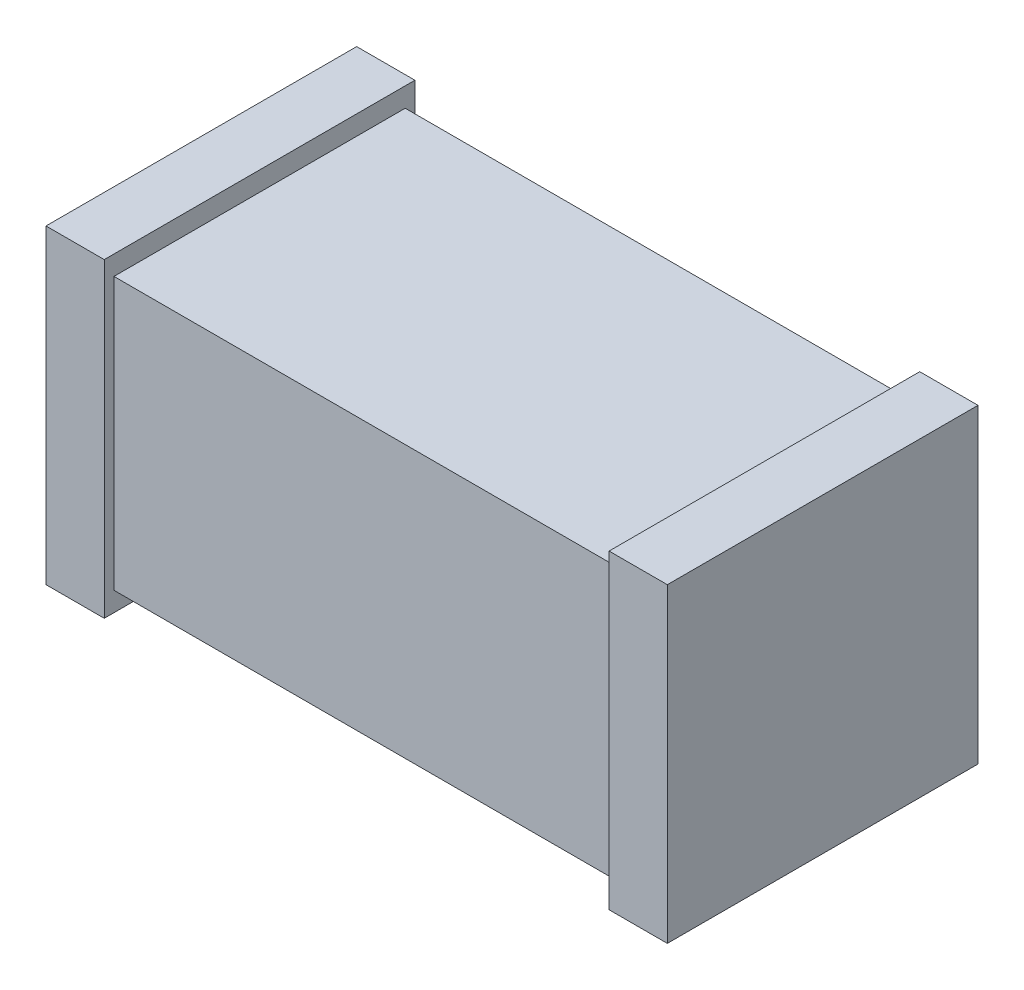
ISO-10303-21;
HEADER;
FILE_DESCRIPTION(('STEP AP214'),'2;1');
FILE_NAME('part.step','',(''),(''),'','','');
FILE_SCHEMA(('AUTOMOTIVE_DESIGN { 1 0 10303 214 1 1 1 1 }'));
ENDSEC;
DATA;
#1=APPLICATION_CONTEXT('core data for automotive mechanical design processes');
#2=APPLICATION_PROTOCOL_DEFINITION('international standard','automotive_design',2000,#1);
#3=PRODUCT_CONTEXT('',#1,'mechanical');
#4=PRODUCT('Part','Part','',(#3));
#5=PRODUCT_RELATED_PRODUCT_CATEGORY('part','',(#4));
#6=PRODUCT_DEFINITION_FORMATION('','',#4);
#7=PRODUCT_DEFINITION_CONTEXT('part definition',#1,'design');
#8=PRODUCT_DEFINITION('design','',#6,#7);
#9=PRODUCT_DEFINITION_SHAPE('','',#8);
#10=(LENGTH_UNIT() NAMED_UNIT(*) SI_UNIT(.MILLI.,.METRE.));
#11=(NAMED_UNIT(*) PLANE_ANGLE_UNIT() SI_UNIT($,.RADIAN.));
#12=(NAMED_UNIT(*) SI_UNIT($,.STERADIAN.) SOLID_ANGLE_UNIT());
#13=UNCERTAINTY_MEASURE_WITH_UNIT(LENGTH_MEASURE(1.E-05),#10,'distance_accuracy_value','');
#14=(GEOMETRIC_REPRESENTATION_CONTEXT(3) GLOBAL_UNCERTAINTY_ASSIGNED_CONTEXT((#13)) GLOBAL_UNIT_ASSIGNED_CONTEXT((#10,
#11,#12)) REPRESENTATION_CONTEXT('',''));
#15=CARTESIAN_POINT('',(0.,0.,0.));
#16=DIRECTION('',(0.,0.,1.));
#17=DIRECTION('',(1.,0.,0.));
#18=AXIS2_PLACEMENT_3D('',#15,#16,#17);
#19=CARTESIAN_POINT('',(0.8,0.4,0.8));
#20=DIRECTION('',(-1.,0.,0.));
#21=DIRECTION('',(0.,0.,1.));
#22=AXIS2_PLACEMENT_3D('',#19,#20,#21);
#23=PLANE('',#22);
#24=DIRECTION('',(0.,0.,-1.));
#25=VECTOR('',#24,1.);
#26=CARTESIAN_POINT('',(0.8,0.4,0.8));
#27=LINE('',#26,#25);
#28=CARTESIAN_POINT('',(0.8,0.4,0.));
#29=VERTEX_POINT('',#28);
#30=CARTESIAN_POINT('',(0.8,0.4,0.8));
#31=VERTEX_POINT('',#30);
#32=EDGE_CURVE('E18',#29,#31,#27,.F.);
#33=ORIENTED_EDGE('',*,*,#32,.T.);
#34=DIRECTION('',(0.,1.,0.));
#35=VECTOR('',#34,1.);
#36=CARTESIAN_POINT('',(0.8,-0.4,0.8));
#37=LINE('',#36,#35);
#38=CARTESIAN_POINT('',(0.8,-0.4,0.8));
#39=VERTEX_POINT('',#38);
#40=EDGE_CURVE('E100',#39,#31,#37,.T.);
#41=ORIENTED_EDGE('',*,*,#40,.F.);
#42=DIRECTION('',(0.,0.,1.));
#43=VECTOR('',#42,1.);
#44=CARTESIAN_POINT('',(0.8,-0.4,0.8));
#45=LINE('',#44,#43);
#46=CARTESIAN_POINT('',(0.8,-0.4,0.));
#47=VERTEX_POINT('',#46);
#48=EDGE_CURVE('E120',#39,#47,#45,.F.);
#49=ORIENTED_EDGE('',*,*,#48,.T.);
#50=DIRECTION('',(0.,1.,0.));
#51=VECTOR('',#50,1.);
#52=CARTESIAN_POINT('',(0.8,-0.4,0.));
#53=LINE('',#52,#51);
#54=EDGE_CURVE('E112',#47,#29,#53,.T.);
#55=ORIENTED_EDGE('',*,*,#54,.T.);
#56=EDGE_LOOP('',(#33,#41,#49,#55));
#57=FACE_BOUND('',#56,.T.);
#58=ADVANCED_FACE('F15',(#57),#23,.F.);
#59=CARTESIAN_POINT('',(-0.8,-0.4,0.8));
#60=DIRECTION('',(1.,0.,0.));
#61=DIRECTION('',(0.,0.,-1.));
#62=AXIS2_PLACEMENT_3D('',#59,#60,#61);
#63=PLANE('',#62);
#64=DIRECTION('',(0.,0.,1.));
#65=VECTOR('',#64,1.);
#66=CARTESIAN_POINT('',(-0.8,-0.4,0.8));
#67=LINE('',#66,#65);
#68=CARTESIAN_POINT('',(-0.8,-0.4,0.));
#69=VERTEX_POINT('',#68);
#70=CARTESIAN_POINT('',(-0.8,-0.4,0.8));
#71=VERTEX_POINT('',#70);
#72=EDGE_CURVE('E130',#69,#71,#67,.T.);
#73=ORIENTED_EDGE('',*,*,#72,.T.);
#74=DIRECTION('',(0.,1.,0.));
#75=VECTOR('',#74,1.);
#76=CARTESIAN_POINT('',(-0.8,0.4,0.8));
#77=LINE('',#76,#75);
#78=CARTESIAN_POINT('',(-0.8,0.4,0.8));
#79=VERTEX_POINT('',#78);
#80=EDGE_CURVE('E133',#79,#71,#77,.F.);
#81=ORIENTED_EDGE('',*,*,#80,.F.);
#82=DIRECTION('',(0.,0.,-1.));
#83=VECTOR('',#82,1.);
#84=CARTESIAN_POINT('',(-0.8,0.4,0.8));
#85=LINE('',#84,#83);
#86=CARTESIAN_POINT('',(-0.8,0.4,0.));
#87=VERTEX_POINT('',#86);
#88=EDGE_CURVE('E140',#79,#87,#85,.T.);
#89=ORIENTED_EDGE('',*,*,#88,.T.);
#90=DIRECTION('',(0.,1.,0.));
#91=VECTOR('',#90,1.);
#92=CARTESIAN_POINT('',(-0.8,0.4,0.));
#93=LINE('',#92,#91);
#94=EDGE_CURVE('E145',#87,#69,#93,.F.);
#95=ORIENTED_EDGE('',*,*,#94,.T.);
#96=EDGE_LOOP('',(#73,#81,#89,#95));
#97=FACE_BOUND('',#96,.T.);
#98=ADVANCED_FACE('F259',(#97),#63,.F.);
#99=CARTESIAN_POINT('',(0.65,0.4,0.8));
#100=DIRECTION('',(0.,-1.,0.));
#101=DIRECTION('',(0.,0.,-1.));
#102=AXIS2_PLACEMENT_3D('',#99,#100,#101);
#103=PLANE('',#102);
#104=DIRECTION('',(0.,0.,-1.));
#105=VECTOR('',#104,1.);
#106=CARTESIAN_POINT('',(0.65,0.4,0.8));
#107=LINE('',#106,#105);
#108=CARTESIAN_POINT('',(0.65,0.4,0.));
#109=VERTEX_POINT('',#108);
#110=CARTESIAN_POINT('',(0.65,0.4,0.8));
#111=VERTEX_POINT('',#110);
#112=EDGE_CURVE('E118',#109,#111,#107,.F.);
#113=ORIENTED_EDGE('',*,*,#112,.T.);
#114=DIRECTION('',(1.,0.,0.));
#115=VECTOR('',#114,1.);
#116=CARTESIAN_POINT('',(0.65,0.4,0.8));
#117=LINE('',#116,#115);
#118=EDGE_CURVE('E107',#31,#111,#117,.F.);
#119=ORIENTED_EDGE('',*,*,#118,.F.);
#120=ORIENTED_EDGE('',*,*,#32,.F.);
#121=DIRECTION('',(1.,0.,0.));
#122=VECTOR('',#121,1.);
#123=CARTESIAN_POINT('',(0.65,0.4,0.));
#124=LINE('',#123,#122);
#125=EDGE_CURVE('E128',#29,#109,#124,.F.);
#126=ORIENTED_EDGE('',*,*,#125,.T.);
#127=EDGE_LOOP('',(#113,#119,#120,#126));
#128=FACE_BOUND('',#127,.T.);
#129=ADVANCED_FACE('F117',(#128),#103,.F.);
#130=CARTESIAN_POINT('',(0.65,-0.4,0.8));
#131=DIRECTION('',(0.,0.,1.));
#132=DIRECTION('',(1.,0.,0.));
#133=AXIS2_PLACEMENT_3D('',#130,#131,#132);
#134=PLANE('',#133);
#135=ORIENTED_EDGE('',*,*,#40,.T.);
#136=ORIENTED_EDGE('',*,*,#118,.T.);
#137=DIRECTION('',(0.,1.,0.));
#138=VECTOR('',#137,1.);
#139=CARTESIAN_POINT('',(0.65,0.4,0.8));
#140=LINE('',#139,#138);
#141=CARTESIAN_POINT('',(0.65,-0.4,0.8));
#142=VERTEX_POINT('',#141);
#143=EDGE_CURVE('E152',#111,#142,#140,.F.);
#144=ORIENTED_EDGE('',*,*,#143,.T.);
#145=DIRECTION('',(1.,0.,0.));
#146=VECTOR('',#145,1.);
#147=CARTESIAN_POINT('',(0.65,-0.4,0.8));
#148=LINE('',#147,#146);
#149=EDGE_CURVE('E109',#142,#39,#148,.T.);
#150=ORIENTED_EDGE('',*,*,#149,.T.);
#151=EDGE_LOOP('',(#135,#136,#144,#150));
#152=FACE_BOUND('',#151,.T.);
#153=ADVANCED_FACE('F104',(#152),#134,.T.);
#154=CARTESIAN_POINT('',(0.65,-0.4,0.8));
#155=DIRECTION('',(0.,1.,0.));
#156=DIRECTION('',(0.,0.,1.));
#157=AXIS2_PLACEMENT_3D('',#154,#155,#156);
#158=PLANE('',#157);
#159=ORIENTED_EDGE('',*,*,#48,.F.);
#160=ORIENTED_EDGE('',*,*,#149,.F.);
#161=DIRECTION('',(0.,0.,-1.));
#162=VECTOR('',#161,1.);
#163=CARTESIAN_POINT('',(0.65,-0.4,0.8));
#164=LINE('',#163,#162);
#165=CARTESIAN_POINT('',(0.65,-0.4,0.));
#166=VERTEX_POINT('',#165);
#167=EDGE_CURVE('E154',#142,#166,#164,.T.);
#168=ORIENTED_EDGE('',*,*,#167,.T.);
#169=DIRECTION('',(1.,0.,0.));
#170=VECTOR('',#169,1.);
#171=CARTESIAN_POINT('',(0.65,-0.4,0.));
#172=LINE('',#171,#170);
#173=EDGE_CURVE('E124',#166,#47,#172,.T.);
#174=ORIENTED_EDGE('',*,*,#173,.T.);
#175=EDGE_LOOP('',(#159,#160,#168,#174));
#176=FACE_BOUND('',#175,.T.);
#177=ADVANCED_FACE('F251',(#176),#158,.F.);
#178=CARTESIAN_POINT('',(0.65,-0.4,0.));
#179=DIRECTION('',(0.,0.,1.));
#180=DIRECTION('',(1.,0.,0.));
#181=AXIS2_PLACEMENT_3D('',#178,#179,#180);
#182=PLANE('',#181);
#183=ORIENTED_EDGE('',*,*,#125,.F.);
#184=ORIENTED_EDGE('',*,*,#54,.F.);
#185=ORIENTED_EDGE('',*,*,#173,.F.);
#186=DIRECTION('',(0.,1.,0.));
#187=VECTOR('',#186,1.);
#188=CARTESIAN_POINT('',(0.65,0.4,0.));
#189=LINE('',#188,#187);
#190=EDGE_CURVE('E157',#166,#109,#189,.T.);
#191=ORIENTED_EDGE('',*,*,#190,.T.);
#192=EDGE_LOOP('',(#183,#184,#185,#191));
#193=FACE_BOUND('',#192,.T.);
#194=ADVANCED_FACE('F247',(#193),#182,.F.);
#195=CARTESIAN_POINT('',(-0.65,-0.4,0.8));
#196=DIRECTION('',(0.,1.,0.));
#197=DIRECTION('',(0.,0.,1.));
#198=AXIS2_PLACEMENT_3D('',#195,#196,#197);
#199=PLANE('',#198);
#200=DIRECTION('',(0.,0.,1.));
#201=VECTOR('',#200,1.);
#202=CARTESIAN_POINT('',(-0.65,-0.4,0.8));
#203=LINE('',#202,#201);
#204=CARTESIAN_POINT('',(-0.65,-0.4,0.));
#205=VERTEX_POINT('',#204);
#206=CARTESIAN_POINT('',(-0.65,-0.4,0.8));
#207=VERTEX_POINT('',#206);
#208=EDGE_CURVE('E168',#205,#207,#203,.T.);
#209=ORIENTED_EDGE('',*,*,#208,.T.);
#210=DIRECTION('',(1.,0.,0.));
#211=VECTOR('',#210,1.);
#212=CARTESIAN_POINT('',(-0.65,-0.4,0.8));
#213=LINE('',#212,#211);
#214=EDGE_CURVE('E135',#71,#207,#213,.T.);
#215=ORIENTED_EDGE('',*,*,#214,.F.);
#216=ORIENTED_EDGE('',*,*,#72,.F.);
#217=DIRECTION('',(1.,0.,0.));
#218=VECTOR('',#217,1.);
#219=CARTESIAN_POINT('',(-0.65,-0.4,0.));
#220=LINE('',#219,#218);
#221=EDGE_CURVE('E148',#69,#205,#220,.T.);
#222=ORIENTED_EDGE('',*,*,#221,.T.);
#223=EDGE_LOOP('',(#209,#215,#216,#222));
#224=FACE_BOUND('',#223,.T.);
#225=ADVANCED_FACE('F243',(#224),#199,.F.);
#226=CARTESIAN_POINT('',(-0.65,0.4,0.8));
#227=DIRECTION('',(0.,0.,1.));
#228=DIRECTION('',(1.,0.,0.));
#229=AXIS2_PLACEMENT_3D('',#226,#227,#228);
#230=PLANE('',#229);
#231=ORIENTED_EDGE('',*,*,#80,.T.);
#232=ORIENTED_EDGE('',*,*,#214,.T.);
#233=DIRECTION('',(0.,1.,0.));
#234=VECTOR('',#233,1.);
#235=CARTESIAN_POINT('',(-0.65,-0.4,0.8));
#236=LINE('',#235,#234);
#237=CARTESIAN_POINT('',(-0.65,0.4,0.8));
#238=VERTEX_POINT('',#237);
#239=EDGE_CURVE('E171',#207,#238,#236,.T.);
#240=ORIENTED_EDGE('',*,*,#239,.T.);
#241=DIRECTION('',(1.,0.,0.));
#242=VECTOR('',#241,1.);
#243=CARTESIAN_POINT('',(-0.65,0.4,0.8));
#244=LINE('',#243,#242);
#245=EDGE_CURVE('E137',#238,#79,#244,.F.);
#246=ORIENTED_EDGE('',*,*,#245,.T.);
#247=EDGE_LOOP('',(#231,#232,#240,#246));
#248=FACE_BOUND('',#247,.T.);
#249=ADVANCED_FACE('F239',(#248),#230,.T.);
#250=CARTESIAN_POINT('',(-0.65,0.4,0.8));
#251=DIRECTION('',(0.,-1.,0.));
#252=DIRECTION('',(0.,0.,-1.));
#253=AXIS2_PLACEMENT_3D('',#250,#251,#252);
#254=PLANE('',#253);
#255=ORIENTED_EDGE('',*,*,#88,.F.);
#256=ORIENTED_EDGE('',*,*,#245,.F.);
#257=DIRECTION('',(0.,0.,1.));
#258=VECTOR('',#257,1.);
#259=CARTESIAN_POINT('',(-0.65,0.4,0.8));
#260=LINE('',#259,#258);
#261=CARTESIAN_POINT('',(-0.65,0.4,0.));
#262=VERTEX_POINT('',#261);
#263=EDGE_CURVE('E174',#238,#262,#260,.F.);
#264=ORIENTED_EDGE('',*,*,#263,.T.);
#265=DIRECTION('',(1.,0.,0.));
#266=VECTOR('',#265,1.);
#267=CARTESIAN_POINT('',(-0.65,0.4,0.));
#268=LINE('',#267,#266);
#269=EDGE_CURVE('E142',#262,#87,#268,.F.);
#270=ORIENTED_EDGE('',*,*,#269,.T.);
#271=EDGE_LOOP('',(#255,#256,#264,#270));
#272=FACE_BOUND('',#271,.T.);
#273=ADVANCED_FACE('F235',(#272),#254,.F.);
#274=CARTESIAN_POINT('',(-0.65,0.4,0.));
#275=DIRECTION('',(0.,0.,1.));
#276=DIRECTION('',(1.,0.,0.));
#277=AXIS2_PLACEMENT_3D('',#274,#275,#276);
#278=PLANE('',#277);
#279=ORIENTED_EDGE('',*,*,#221,.F.);
#280=ORIENTED_EDGE('',*,*,#94,.F.);
#281=ORIENTED_EDGE('',*,*,#269,.F.);
#282=DIRECTION('',(0.,1.,0.));
#283=VECTOR('',#282,1.);
#284=CARTESIAN_POINT('',(-0.65,-0.4,0.));
#285=LINE('',#284,#283);
#286=EDGE_CURVE('E177',#262,#205,#285,.F.);
#287=ORIENTED_EDGE('',*,*,#286,.T.);
#288=EDGE_LOOP('',(#279,#280,#281,#287));
#289=FACE_BOUND('',#288,.T.);
#290=ADVANCED_FACE('F231',(#289),#278,.F.);
#291=CARTESIAN_POINT('',(-0.65,-0.35,0.775));
#292=DIRECTION('',(0.,1.,0.));
#293=DIRECTION('',(0.,0.,1.));
#294=AXIS2_PLACEMENT_3D('',#291,#292,#293);
#295=PLANE('',#294);
#296=DIRECTION('',(0.,0.,-1.));
#297=VECTOR('',#296,1.);
#298=CARTESIAN_POINT('',(0.65,-0.35,0.8));
#299=LINE('',#298,#297);
#300=CARTESIAN_POINT('',(0.65,-0.35,0.025));
#301=VERTEX_POINT('',#300);
#302=CARTESIAN_POINT('',(0.65,-0.35,0.775));
#303=VERTEX_POINT('',#302);
#304=EDGE_CURVE('E160',#301,#303,#299,.F.);
#305=ORIENTED_EDGE('',*,*,#304,.T.);
#306=DIRECTION('',(-1.,0.,0.));
#307=VECTOR('',#306,1.);
#308=CARTESIAN_POINT('',(0.65,-0.35,0.775));
#309=LINE('',#308,#307);
#310=CARTESIAN_POINT('',(-0.65,-0.35,0.775));
#311=VERTEX_POINT('',#310);
#312=EDGE_CURVE('E163',#303,#311,#309,.T.);
#313=ORIENTED_EDGE('',*,*,#312,.T.);
#314=DIRECTION('',(0.,0.,1.));
#315=VECTOR('',#314,1.);
#316=CARTESIAN_POINT('',(-0.65,-0.35,0.8));
#317=LINE('',#316,#315);
#318=CARTESIAN_POINT('',(-0.65,-0.35,0.025));
#319=VERTEX_POINT('',#318);
#320=EDGE_CURVE('E183',#311,#319,#317,.F.);
#321=ORIENTED_EDGE('',*,*,#320,.T.);
#322=DIRECTION('',(-1.,0.,0.));
#323=VECTOR('',#322,1.);
#324=CARTESIAN_POINT('',(0.65,-0.35,0.025));
#325=LINE('',#324,#323);
#326=EDGE_CURVE('E189',#301,#319,#325,.T.);
#327=ORIENTED_EDGE('',*,*,#326,.F.);
#328=EDGE_LOOP('',(#305,#313,#321,#327));
#329=FACE_BOUND('',#328,.T.);
#330=ADVANCED_FACE('F228',(#329),#295,.F.);
#331=CARTESIAN_POINT('',(0.65,0.4,0.8));
#332=DIRECTION('',(1.,0.,0.));
#333=DIRECTION('',(0.,0.,-1.));
#334=AXIS2_PLACEMENT_3D('',#331,#332,#333);
#335=PLANE('',#334);
#336=DIRECTION('',(0.,1.,0.));
#337=VECTOR('',#336,1.);
#338=CARTESIAN_POINT('',(0.65,0.35,0.775));
#339=LINE('',#338,#337);
#340=CARTESIAN_POINT('',(0.65,0.35,0.775));
#341=VERTEX_POINT('',#340);
#342=EDGE_CURVE('E165',#341,#303,#339,.F.);
#343=ORIENTED_EDGE('',*,*,#342,.T.);
#344=ORIENTED_EDGE('',*,*,#304,.F.);
#345=DIRECTION('',(0.,1.,0.));
#346=VECTOR('',#345,1.);
#347=CARTESIAN_POINT('',(0.65,0.35,0.025));
#348=LINE('',#347,#346);
#349=CARTESIAN_POINT('',(0.65,0.35,0.025));
#350=VERTEX_POINT('',#349);
#351=EDGE_CURVE('E186',#350,#301,#348,.F.);
#352=ORIENTED_EDGE('',*,*,#351,.F.);
#353=DIRECTION('',(0.,0.,-1.));
#354=VECTOR('',#353,1.);
#355=CARTESIAN_POINT('',(0.65,0.35,0.775));
#356=LINE('',#355,#354);
#357=EDGE_CURVE('E192',#350,#341,#356,.F.);
#358=ORIENTED_EDGE('',*,*,#357,.T.);
#359=EDGE_LOOP('',(#343,#344,#352,#358));
#360=FACE_BOUND('',#359,.T.);
#361=ORIENTED_EDGE('',*,*,#167,.F.);
#362=ORIENTED_EDGE('',*,*,#143,.F.);
#363=ORIENTED_EDGE('',*,*,#112,.F.);
#364=ORIENTED_EDGE('',*,*,#190,.F.);
#365=EDGE_LOOP('',(#361,#362,#363,#364));
#366=FACE_BOUND('',#365,.T.);
#367=ADVANCED_FACE('F210',(#360,#366),#335,.F.);
#368=CARTESIAN_POINT('',(0.65,0.35,0.775));
#369=DIRECTION('',(0.,0.,-1.));
#370=DIRECTION('',(-1.,0.,0.));
#371=AXIS2_PLACEMENT_3D('',#368,#369,#370);
#372=PLANE('',#371);
#373=DIRECTION('',(1.,0.,0.));
#374=VECTOR('',#373,1.);
#375=CARTESIAN_POINT('',(-0.65,0.35,0.775));
#376=LINE('',#375,#374);
#377=CARTESIAN_POINT('',(-0.65,0.35,0.775));
#378=VERTEX_POINT('',#377);
#379=EDGE_CURVE('E195',#341,#378,#376,.F.);
#380=ORIENTED_EDGE('',*,*,#379,.T.);
#381=DIRECTION('',(0.,1.,0.));
#382=VECTOR('',#381,1.);
#383=CARTESIAN_POINT('',(-0.65,-0.4,0.775));
#384=LINE('',#383,#382);
#385=EDGE_CURVE('E180',#378,#311,#384,.F.);
#386=ORIENTED_EDGE('',*,*,#385,.T.);
#387=ORIENTED_EDGE('',*,*,#312,.F.);
#388=ORIENTED_EDGE('',*,*,#342,.F.);
#389=EDGE_LOOP('',(#380,#386,#387,#388));
#390=FACE_BOUND('',#389,.T.);
#391=ADVANCED_FACE('F208',(#390),#372,.F.);
#392=CARTESIAN_POINT('',(-0.65,-0.4,0.8));
#393=DIRECTION('',(-1.,0.,0.));
#394=DIRECTION('',(0.,0.,1.));
#395=AXIS2_PLACEMENT_3D('',#392,#393,#394);
#396=PLANE('',#395);
#397=ORIENTED_EDGE('',*,*,#385,.F.);
#398=DIRECTION('',(0.,0.,-1.));
#399=VECTOR('',#398,1.);
#400=CARTESIAN_POINT('',(-0.65,0.35,0.775));
#401=LINE('',#400,#399);
#402=CARTESIAN_POINT('',(-0.65,0.35,0.025));
#403=VERTEX_POINT('',#402);
#404=EDGE_CURVE('E24',#378,#403,#401,.T.);
#405=ORIENTED_EDGE('',*,*,#404,.T.);
#406=DIRECTION('',(0.,1.,0.));
#407=VECTOR('',#406,1.);
#408=CARTESIAN_POINT('',(-0.65,0.35,0.025));
#409=LINE('',#408,#407);
#410=EDGE_CURVE('E32',#319,#403,#409,.T.);
#411=ORIENTED_EDGE('',*,*,#410,.F.);
#412=ORIENTED_EDGE('',*,*,#320,.F.);
#413=EDGE_LOOP('',(#397,#405,#411,#412));
#414=FACE_BOUND('',#413,.T.);
#415=ORIENTED_EDGE('',*,*,#263,.F.);
#416=ORIENTED_EDGE('',*,*,#239,.F.);
#417=ORIENTED_EDGE('',*,*,#208,.F.);
#418=ORIENTED_EDGE('',*,*,#286,.F.);
#419=EDGE_LOOP('',(#415,#416,#417,#418));
#420=FACE_BOUND('',#419,.T.);
#421=ADVANCED_FACE('F201',(#414,#420),#396,.F.);
#422=CARTESIAN_POINT('',(0.65,0.35,0.025));
#423=DIRECTION('',(0.,0.,-1.));
#424=DIRECTION('',(-1.,0.,0.));
#425=AXIS2_PLACEMENT_3D('',#422,#423,#424);
#426=PLANE('',#425);
#427=ORIENTED_EDGE('',*,*,#410,.T.);
#428=DIRECTION('',(1.,0.,0.));
#429=VECTOR('',#428,1.);
#430=CARTESIAN_POINT('',(-0.65,0.35,0.025));
#431=LINE('',#430,#429);
#432=EDGE_CURVE('E10',#403,#350,#431,.T.);
#433=ORIENTED_EDGE('',*,*,#432,.T.);
#434=ORIENTED_EDGE('',*,*,#351,.T.);
#435=ORIENTED_EDGE('',*,*,#326,.T.);
#436=EDGE_LOOP('',(#427,#433,#434,#435));
#437=FACE_BOUND('',#436,.T.);
#438=ADVANCED_FACE('F214',(#437),#426,.T.);
#439=CARTESIAN_POINT('',(-0.65,0.35,0.775));
#440=DIRECTION('',(0.,-1.,0.));
#441=DIRECTION('',(0.,0.,-1.));
#442=AXIS2_PLACEMENT_3D('',#439,#440,#441);
#443=PLANE('',#442);
#444=ORIENTED_EDGE('',*,*,#404,.F.);
#445=ORIENTED_EDGE('',*,*,#379,.F.);
#446=ORIENTED_EDGE('',*,*,#357,.F.);
#447=ORIENTED_EDGE('',*,*,#432,.F.);
#448=EDGE_LOOP('',(#444,#445,#446,#447));
#449=FACE_BOUND('',#448,.T.);
#450=ADVANCED_FACE('F206',(#449),#443,.F.);
#451=CLOSED_SHELL('',(#58,#98,#129,#153,#177,#194,#225,#249,#273,#290,#330,#367,#391,#421,#438,#450));
#452=MANIFOLD_SOLID_BREP('B1',#451);
#453=ADVANCED_BREP_SHAPE_REPRESENTATION('',(#18,#452),#14);
#454=SHAPE_DEFINITION_REPRESENTATION(#9,#453);
ENDSEC;
END-ISO-10303-21;
